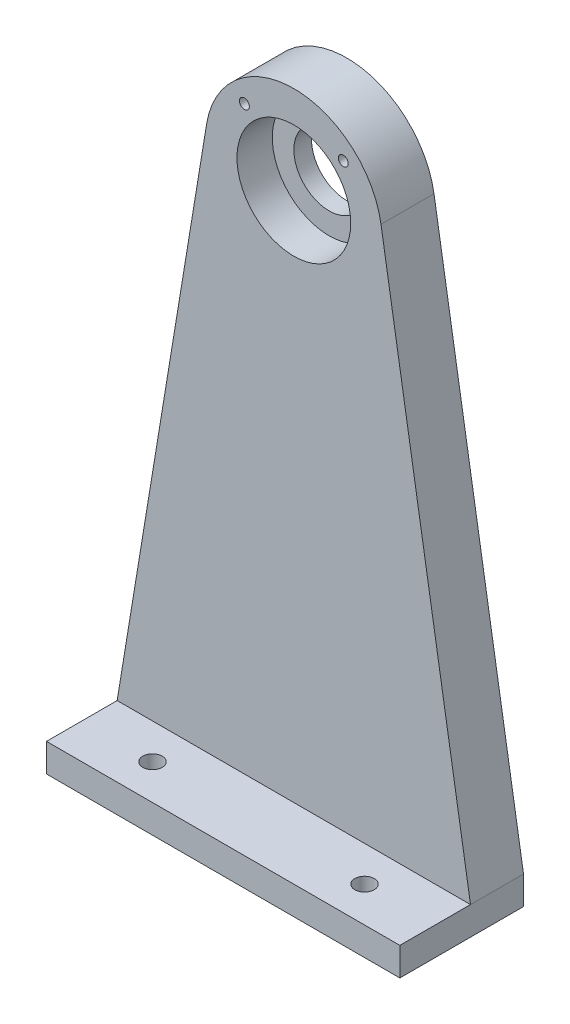
ISO-10303-21;
HEADER;
FILE_DESCRIPTION(('STEP AP214'),'2;1');
FILE_NAME('part.step','',(''),(''),'','','');
FILE_SCHEMA(('AUTOMOTIVE_DESIGN { 1 0 10303 214 1 1 1 1 }'));
ENDSEC;
DATA;
#1=APPLICATION_CONTEXT('core data for automotive mechanical design processes');
#2=APPLICATION_PROTOCOL_DEFINITION('international standard','automotive_design',2000,#1);
#3=PRODUCT_CONTEXT('',#1,'mechanical');
#4=PRODUCT('Part','Part','',(#3));
#5=PRODUCT_RELATED_PRODUCT_CATEGORY('part','',(#4));
#6=PRODUCT_DEFINITION_FORMATION('','',#4);
#7=PRODUCT_DEFINITION_CONTEXT('part definition',#1,'design');
#8=PRODUCT_DEFINITION('design','',#6,#7);
#9=PRODUCT_DEFINITION_SHAPE('','',#8);
#10=(LENGTH_UNIT() NAMED_UNIT(*) SI_UNIT(.MILLI.,.METRE.));
#11=(NAMED_UNIT(*) PLANE_ANGLE_UNIT() SI_UNIT($,.RADIAN.));
#12=(NAMED_UNIT(*) SI_UNIT($,.STERADIAN.) SOLID_ANGLE_UNIT());
#13=UNCERTAINTY_MEASURE_WITH_UNIT(LENGTH_MEASURE(1.E-05),#10,'distance_accuracy_value','');
#14=(GEOMETRIC_REPRESENTATION_CONTEXT(3) GLOBAL_UNCERTAINTY_ASSIGNED_CONTEXT((#13)) GLOBAL_UNIT_ASSIGNED_CONTEXT((#10,
#11,#12)) REPRESENTATION_CONTEXT('',''));
#15=CARTESIAN_POINT('',(0.,0.,0.));
#16=DIRECTION('',(0.,0.,1.));
#17=DIRECTION('',(1.,0.,0.));
#18=AXIS2_PLACEMENT_3D('',#15,#16,#17);
#19=CARTESIAN_POINT('',(0.,0.,7.5));
#20=DIRECTION('',(0.,0.,-1.));
#21=DIRECTION('',(-1.,0.,0.));
#22=AXIS2_PLACEMENT_3D('',#19,#20,#21);
#23=CYLINDRICAL_SURFACE('',#22,25.);
#24=CARTESIAN_POINT('',(0.,0.,-7.5));
#25=DIRECTION('',(0.,0.,1.));
#26=DIRECTION('',(1.,0.,0.));
#27=AXIS2_PLACEMENT_3D('',#24,#25,#26);
#28=CIRCLE('',#27,25.);
#29=CARTESIAN_POINT('',(24.668742493994,4.056247497998,-7.5));
#30=VERTEX_POINT('',#29);
#31=CARTESIAN_POINT('',(-24.668742493994,4.05624749799799,-7.5));
#32=VERTEX_POINT('',#31);
#33=EDGE_CURVE('E105',#30,#32,#28,.T.);
#34=ORIENTED_EDGE('',*,*,#33,.T.);
#35=DIRECTION('',(0.,0.,-1.));
#36=VECTOR('',#35,1.);
#37=CARTESIAN_POINT('',(-24.668742493994,4.05624749799799,7.5));
#38=LINE('',#37,#36);
#39=CARTESIAN_POINT('',(-24.668742493994,4.05624749799799,7.5));
#40=VERTEX_POINT('',#39);
#41=EDGE_CURVE('E11',#40,#32,#38,.T.);
#42=ORIENTED_EDGE('',*,*,#41,.F.);
#43=CARTESIAN_POINT('',(0.,0.,7.5));
#44=DIRECTION('',(0.,0.,1.));
#45=DIRECTION('',(1.,0.,0.));
#46=AXIS2_PLACEMENT_3D('',#43,#44,#45);
#47=CIRCLE('',#46,25.);
#48=CARTESIAN_POINT('',(24.668742493994,4.056247497998,7.5));
#49=VERTEX_POINT('',#48);
#50=EDGE_CURVE('E97',#49,#40,#47,.T.);
#51=ORIENTED_EDGE('',*,*,#50,.F.);
#52=DIRECTION('',(0.,0.,-1.));
#53=VECTOR('',#52,1.);
#54=CARTESIAN_POINT('',(24.668742493994,4.056247497998,7.5));
#55=LINE('',#54,#53);
#56=EDGE_CURVE('E106',#49,#30,#55,.T.);
#57=ORIENTED_EDGE('',*,*,#56,.T.);
#58=EDGE_LOOP('',(#34,#42,#51,#57));
#59=FACE_BOUND('',#58,.T.);
#60=ADVANCED_FACE('F41',(#59),#23,.T.);
#61=CARTESIAN_POINT('',(-50.,-150.,7.5));
#62=DIRECTION('',(0.98674969975976,-0.16224989991992,0.));
#63=DIRECTION('',(0.16224989991992,0.98674969975976,0.));
#64=AXIS2_PLACEMENT_3D('',#61,#62,#63);
#65=PLANE('',#64);
#66=DIRECTION('',(-0.16224989991992,-0.98674969975976,0.));
#67=VECTOR('',#66,1.);
#68=CARTESIAN_POINT('',(-50.,-150.,-7.5));
#69=LINE('',#68,#67);
#70=CARTESIAN_POINT('',(-50.,-150.,-7.5));
#71=VERTEX_POINT('',#70);
#72=EDGE_CURVE('E72',#32,#71,#69,.T.);
#73=ORIENTED_EDGE('',*,*,#72,.T.);
#74=DIRECTION('',(0.,0.,-1.));
#75=VECTOR('',#74,1.);
#76=CARTESIAN_POINT('',(-50.,-150.,7.5));
#77=LINE('',#76,#75);
#78=CARTESIAN_POINT('',(-50.,-150.,7.5));
#79=VERTEX_POINT('',#78);
#80=EDGE_CURVE('E50',#79,#71,#77,.T.);
#81=ORIENTED_EDGE('',*,*,#80,.F.);
#82=DIRECTION('',(-0.16224989991992,-0.98674969975976,0.));
#83=VECTOR('',#82,1.);
#84=CARTESIAN_POINT('',(-50.,-150.,7.5));
#85=LINE('',#84,#83);
#86=EDGE_CURVE('E92',#40,#79,#85,.T.);
#87=ORIENTED_EDGE('',*,*,#86,.F.);
#88=ORIENTED_EDGE('',*,*,#41,.T.);
#89=EDGE_LOOP('',(#73,#81,#87,#88));
#90=FACE_BOUND('',#89,.T.);
#91=ADVANCED_FACE('F93',(#90),#65,.F.);
#92=CARTESIAN_POINT('',(24.668742493994,4.056247497998,7.5));
#93=DIRECTION('',(-0.98674969975976,-0.16224989991992,0.));
#94=DIRECTION('',(0.16224989991992,-0.98674969975976,0.));
#95=AXIS2_PLACEMENT_3D('',#92,#93,#94);
#96=PLANE('',#95);
#97=DIRECTION('',(-0.16224989991992,0.98674969975976,0.));
#98=VECTOR('',#97,1.);
#99=CARTESIAN_POINT('',(24.668742493994,4.056247497998,-7.5));
#100=LINE('',#99,#98);
#101=CARTESIAN_POINT('',(50.,-150.,-7.5));
#102=VERTEX_POINT('',#101);
#103=EDGE_CURVE('E103',#102,#30,#100,.T.);
#104=ORIENTED_EDGE('',*,*,#103,.T.);
#105=ORIENTED_EDGE('',*,*,#56,.F.);
#106=DIRECTION('',(-0.16224989991992,0.98674969975976,0.));
#107=VECTOR('',#106,1.);
#108=CARTESIAN_POINT('',(24.668742493994,4.056247497998,7.5));
#109=LINE('',#108,#107);
#110=CARTESIAN_POINT('',(50.,-150.,7.5));
#111=VERTEX_POINT('',#110);
#112=EDGE_CURVE('E59',#111,#49,#109,.T.);
#113=ORIENTED_EDGE('',*,*,#112,.F.);
#114=DIRECTION('',(0.,0.,-1.));
#115=VECTOR('',#114,1.);
#116=CARTESIAN_POINT('',(50.,-150.,7.5));
#117=LINE('',#116,#115);
#118=EDGE_CURVE('E118',#111,#102,#117,.T.);
#119=ORIENTED_EDGE('',*,*,#118,.T.);
#120=EDGE_LOOP('',(#104,#105,#113,#119));
#121=FACE_BOUND('',#120,.T.);
#122=ADVANCED_FACE('F174',(#121),#96,.F.);
#123=CARTESIAN_POINT('',(0.,0.,7.5));
#124=DIRECTION('',(0.,0.,1.));
#125=DIRECTION('',(1.,0.,0.));
#126=AXIS2_PLACEMENT_3D('',#123,#124,#125);
#127=PLANE('',#126);
#128=CARTESIAN_POINT('',(14.,14.2828568570857,7.5));
#129=DIRECTION('',(0.,0.,1.));
#130=DIRECTION('',(1.,0.,0.));
#131=AXIS2_PLACEMENT_3D('',#128,#129,#130);
#132=CIRCLE('',#131,1.4);
#133=CARTESIAN_POINT('',(15.4,14.2828568570857,7.5));
#134=VERTEX_POINT('',#133);
#135=EDGE_CURVE('E310',#134,#134,#132,.T.);
#136=ORIENTED_EDGE('',*,*,#135,.F.);
#137=EDGE_LOOP('',(#136));
#138=FACE_BOUND('',#137,.T.);
#139=CARTESIAN_POINT('',(-14.,14.2828568570857,7.5));
#140=DIRECTION('',(0.,0.,1.));
#141=DIRECTION('',(1.,0.,0.));
#142=AXIS2_PLACEMENT_3D('',#139,#140,#141);
#143=CIRCLE('',#142,1.4);
#144=CARTESIAN_POINT('',(-12.6,14.2828568570857,7.5));
#145=VERTEX_POINT('',#144);
#146=EDGE_CURVE('E297',#145,#145,#143,.T.);
#147=ORIENTED_EDGE('',*,*,#146,.F.);
#148=EDGE_LOOP('',(#147));
#149=FACE_BOUND('',#148,.T.);
#150=CARTESIAN_POINT('',(0.,0.,7.5));
#151=DIRECTION('',(0.,0.,1.));
#152=DIRECTION('',(1.,0.,0.));
#153=AXIS2_PLACEMENT_3D('',#150,#151,#152);
#154=CIRCLE('',#153,16.1);
#155=CARTESIAN_POINT('',(16.1,0.,7.5));
#156=VERTEX_POINT('',#155);
#157=EDGE_CURVE('E124',#156,#156,#154,.T.);
#158=ORIENTED_EDGE('',*,*,#157,.F.);
#159=EDGE_LOOP('',(#158));
#160=FACE_BOUND('',#159,.T.);
#161=ORIENTED_EDGE('',*,*,#50,.T.);
#162=ORIENTED_EDGE('',*,*,#86,.T.);
#163=DIRECTION('',(1.,0.,0.));
#164=VECTOR('',#163,1.);
#165=CARTESIAN_POINT('',(50.,-150.,7.5));
#166=LINE('',#165,#164);
#167=EDGE_CURVE('E80',#79,#111,#166,.T.);
#168=ORIENTED_EDGE('',*,*,#167,.T.);
#169=ORIENTED_EDGE('',*,*,#112,.T.);
#170=EDGE_LOOP('',(#161,#162,#168,#169));
#171=FACE_BOUND('',#170,.T.);
#172=ADVANCED_FACE('F100',(#138,#149,#160,#171),#127,.T.);
#173=CARTESIAN_POINT('',(0.,0.,-7.5));
#174=DIRECTION('',(0.,0.,1.));
#175=DIRECTION('',(1.,0.,0.));
#176=AXIS2_PLACEMENT_3D('',#173,#174,#175);
#177=PLANE('',#176);
#178=CARTESIAN_POINT('',(-9.,-50.,-7.5));
#179=DIRECTION('',(0.,0.,-1.));
#180=DIRECTION('',(-1.,0.,0.));
#181=AXIS2_PLACEMENT_3D('',#178,#179,#180);
#182=CIRCLE('',#181,1.4);
#183=CARTESIAN_POINT('',(-10.4,-50.,-7.5));
#184=VERTEX_POINT('',#183);
#185=EDGE_CURVE('E294',#184,#184,#182,.T.);
#186=ORIENTED_EDGE('',*,*,#185,.F.);
#187=EDGE_LOOP('',(#186));
#188=FACE_BOUND('',#187,.T.);
#189=CARTESIAN_POINT('',(9.,-50.,-7.5));
#190=DIRECTION('',(0.,0.,-1.));
#191=DIRECTION('',(-1.,0.,0.));
#192=AXIS2_PLACEMENT_3D('',#189,#190,#191);
#193=CIRCLE('',#192,1.4);
#194=CARTESIAN_POINT('',(7.6,-50.,-7.5));
#195=VERTEX_POINT('',#194);
#196=EDGE_CURVE('E299',#195,#195,#193,.T.);
#197=ORIENTED_EDGE('',*,*,#196,.F.);
#198=EDGE_LOOP('',(#197));
#199=FACE_BOUND('',#198,.T.);
#200=CARTESIAN_POINT('',(0.,0.,-7.5));
#201=DIRECTION('',(0.,0.,1.));
#202=DIRECTION('',(1.,0.,0.));
#203=AXIS2_PLACEMENT_3D('',#200,#201,#202);
#204=CIRCLE('',#203,10.);
#205=CARTESIAN_POINT('',(10.,0.,-7.5));
#206=VERTEX_POINT('',#205);
#207=EDGE_CURVE('E122',#206,#206,#204,.T.);
#208=ORIENTED_EDGE('',*,*,#207,.T.);
#209=EDGE_LOOP('',(#208));
#210=FACE_BOUND('',#209,.T.);
#211=ORIENTED_EDGE('',*,*,#33,.F.);
#212=ORIENTED_EDGE('',*,*,#103,.F.);
#213=DIRECTION('',(0.,1.,0.));
#214=VECTOR('',#213,1.);
#215=CARTESIAN_POINT('',(50.,-158.,-7.5));
#216=LINE('',#215,#214);
#217=CARTESIAN_POINT('',(50.,-158.,-7.5));
#218=VERTEX_POINT('',#217);
#219=EDGE_CURVE('E111',#218,#102,#216,.T.);
#220=ORIENTED_EDGE('',*,*,#219,.F.);
#221=DIRECTION('',(1.,0.,0.));
#222=VECTOR('',#221,1.);
#223=CARTESIAN_POINT('',(-50.,-158.,-7.5));
#224=LINE('',#223,#222);
#225=CARTESIAN_POINT('',(-50.,-158.,-7.5));
#226=VERTEX_POINT('',#225);
#227=EDGE_CURVE('E151',#226,#218,#224,.T.);
#228=ORIENTED_EDGE('',*,*,#227,.F.);
#229=DIRECTION('',(0.,1.,0.));
#230=VECTOR('',#229,1.);
#231=CARTESIAN_POINT('',(-50.,-158.,-7.5));
#232=LINE('',#231,#230);
#233=EDGE_CURVE('E108',#226,#71,#232,.T.);
#234=ORIENTED_EDGE('',*,*,#233,.T.);
#235=ORIENTED_EDGE('',*,*,#72,.F.);
#236=EDGE_LOOP('',(#211,#212,#220,#228,#234,#235));
#237=FACE_BOUND('',#236,.T.);
#238=ADVANCED_FACE('F177',(#188,#199,#210,#237),#177,.F.);
#239=CARTESIAN_POINT('',(0.,-150.,0.));
#240=DIRECTION('',(0.,1.,0.));
#241=DIRECTION('',(0.,0.,1.));
#242=AXIS2_PLACEMENT_3D('',#239,#240,#241);
#243=PLANE('',#242);
#244=CARTESIAN_POINT('',(30.,-150.,17.5));
#245=DIRECTION('',(0.,1.,0.));
#246=DIRECTION('',(0.,0.,1.));
#247=AXIS2_PLACEMENT_3D('',#244,#245,#246);
#248=CIRCLE('',#247,2.75);
#249=CARTESIAN_POINT('',(30.,-150.,20.25));
#250=VERTEX_POINT('',#249);
#251=EDGE_CURVE('E138',#250,#250,#248,.T.);
#252=ORIENTED_EDGE('',*,*,#251,.F.);
#253=EDGE_LOOP('',(#252));
#254=FACE_BOUND('',#253,.T.);
#255=CARTESIAN_POINT('',(-30.,-150.,17.5));
#256=DIRECTION('',(0.,1.,0.));
#257=DIRECTION('',(0.,0.,1.));
#258=AXIS2_PLACEMENT_3D('',#255,#256,#257);
#259=CIRCLE('',#258,2.75);
#260=CARTESIAN_POINT('',(-30.,-150.,20.25));
#261=VERTEX_POINT('',#260);
#262=EDGE_CURVE('E128',#261,#261,#259,.T.);
#263=ORIENTED_EDGE('',*,*,#262,.F.);
#264=EDGE_LOOP('',(#263));
#265=FACE_BOUND('',#264,.T.);
#266=ORIENTED_EDGE('',*,*,#167,.F.);
#267=DIRECTION('',(0.,0.,-1.));
#268=VECTOR('',#267,1.);
#269=CARTESIAN_POINT('',(-50.,-150.,-7.5));
#270=LINE('',#269,#268);
#271=CARTESIAN_POINT('',(-50.,-150.,27.5));
#272=VERTEX_POINT('',#271);
#273=EDGE_CURVE('E145',#272,#79,#270,.T.);
#274=ORIENTED_EDGE('',*,*,#273,.F.);
#275=DIRECTION('',(-1.,0.,0.));
#276=VECTOR('',#275,1.);
#277=CARTESIAN_POINT('',(-50.,-150.,27.5));
#278=LINE('',#277,#276);
#279=CARTESIAN_POINT('',(50.,-150.,27.5));
#280=VERTEX_POINT('',#279);
#281=EDGE_CURVE('E152',#280,#272,#278,.T.);
#282=ORIENTED_EDGE('',*,*,#281,.F.);
#283=DIRECTION('',(0.,0.,1.));
#284=VECTOR('',#283,1.);
#285=CARTESIAN_POINT('',(50.,-150.,-7.5));
#286=LINE('',#285,#284);
#287=EDGE_CURVE('E162',#111,#280,#286,.T.);
#288=ORIENTED_EDGE('',*,*,#287,.F.);
#289=EDGE_LOOP('',(#266,#274,#282,#288));
#290=FACE_BOUND('',#289,.T.);
#291=ADVANCED_FACE('F200',(#254,#265,#290),#243,.T.);
#292=CARTESIAN_POINT('',(-50.,-158.,-7.5));
#293=DIRECTION('',(1.,0.,0.));
#294=DIRECTION('',(0.,0.,-1.));
#295=AXIS2_PLACEMENT_3D('',#292,#293,#294);
#296=PLANE('',#295);
#297=ORIENTED_EDGE('',*,*,#273,.T.);
#298=ORIENTED_EDGE('',*,*,#80,.T.);
#299=ORIENTED_EDGE('',*,*,#233,.F.);
#300=DIRECTION('',(0.,0.,-1.));
#301=VECTOR('',#300,1.);
#302=CARTESIAN_POINT('',(-50.,-158.,-7.5));
#303=LINE('',#302,#301);
#304=CARTESIAN_POINT('',(-50.,-158.,27.5));
#305=VERTEX_POINT('',#304);
#306=EDGE_CURVE('E148',#305,#226,#303,.T.);
#307=ORIENTED_EDGE('',*,*,#306,.F.);
#308=DIRECTION('',(0.,1.,0.));
#309=VECTOR('',#308,1.);
#310=CARTESIAN_POINT('',(-50.,-158.,27.5));
#311=LINE('',#310,#309);
#312=EDGE_CURVE('E160',#305,#272,#311,.T.);
#313=ORIENTED_EDGE('',*,*,#312,.T.);
#314=EDGE_LOOP('',(#297,#298,#299,#307,#313));
#315=FACE_BOUND('',#314,.T.);
#316=ADVANCED_FACE('F198',(#315),#296,.F.);
#317=CARTESIAN_POINT('',(50.,-158.,-7.5));
#318=DIRECTION('',(-1.,0.,0.));
#319=DIRECTION('',(0.,0.,1.));
#320=AXIS2_PLACEMENT_3D('',#317,#318,#319);
#321=PLANE('',#320);
#322=ORIENTED_EDGE('',*,*,#118,.F.);
#323=ORIENTED_EDGE('',*,*,#287,.T.);
#324=DIRECTION('',(0.,1.,0.));
#325=VECTOR('',#324,1.);
#326=CARTESIAN_POINT('',(50.,-158.,27.5));
#327=LINE('',#326,#325);
#328=CARTESIAN_POINT('',(50.,-158.,27.5));
#329=VERTEX_POINT('',#328);
#330=EDGE_CURVE('E169',#329,#280,#327,.T.);
#331=ORIENTED_EDGE('',*,*,#330,.F.);
#332=DIRECTION('',(0.,0.,1.));
#333=VECTOR('',#332,1.);
#334=CARTESIAN_POINT('',(50.,-158.,-7.5));
#335=LINE('',#334,#333);
#336=EDGE_CURVE('E155',#218,#329,#335,.T.);
#337=ORIENTED_EDGE('',*,*,#336,.F.);
#338=ORIENTED_EDGE('',*,*,#219,.T.);
#339=EDGE_LOOP('',(#322,#323,#331,#337,#338));
#340=FACE_BOUND('',#339,.T.);
#341=ADVANCED_FACE('F208',(#340),#321,.F.);
#342=CARTESIAN_POINT('',(-50.,-158.,27.5));
#343=DIRECTION('',(0.,0.,-1.));
#344=DIRECTION('',(-1.,0.,0.));
#345=AXIS2_PLACEMENT_3D('',#342,#343,#344);
#346=PLANE('',#345);
#347=ORIENTED_EDGE('',*,*,#281,.T.);
#348=ORIENTED_EDGE('',*,*,#312,.F.);
#349=DIRECTION('',(-1.,0.,0.));
#350=VECTOR('',#349,1.);
#351=CARTESIAN_POINT('',(-50.,-158.,27.5));
#352=LINE('',#351,#350);
#353=EDGE_CURVE('E158',#329,#305,#352,.T.);
#354=ORIENTED_EDGE('',*,*,#353,.F.);
#355=ORIENTED_EDGE('',*,*,#330,.T.);
#356=EDGE_LOOP('',(#347,#348,#354,#355));
#357=FACE_BOUND('',#356,.T.);
#358=ADVANCED_FACE('F193',(#357),#346,.F.);
#359=CARTESIAN_POINT('',(0.,-158.,0.));
#360=DIRECTION('',(0.,1.,0.));
#361=DIRECTION('',(0.,0.,1.));
#362=AXIS2_PLACEMENT_3D('',#359,#360,#361);
#363=PLANE('',#362);
#364=CARTESIAN_POINT('',(30.,-158.,17.5));
#365=DIRECTION('',(0.,1.,0.));
#366=DIRECTION('',(0.,0.,1.));
#367=AXIS2_PLACEMENT_3D('',#364,#365,#366);
#368=CIRCLE('',#367,2.75);
#369=CARTESIAN_POINT('',(30.,-158.,20.25));
#370=VERTEX_POINT('',#369);
#371=EDGE_CURVE('E44',#370,#370,#368,.T.);
#372=ORIENTED_EDGE('',*,*,#371,.T.);
#373=EDGE_LOOP('',(#372));
#374=FACE_BOUND('',#373,.T.);
#375=CARTESIAN_POINT('',(-30.,-158.,17.5));
#376=DIRECTION('',(0.,1.,0.));
#377=DIRECTION('',(0.,0.,1.));
#378=AXIS2_PLACEMENT_3D('',#375,#376,#377);
#379=CIRCLE('',#378,2.75);
#380=CARTESIAN_POINT('',(-30.,-158.,20.25));
#381=VERTEX_POINT('',#380);
#382=EDGE_CURVE('E126',#381,#381,#379,.T.);
#383=ORIENTED_EDGE('',*,*,#382,.T.);
#384=EDGE_LOOP('',(#383));
#385=FACE_BOUND('',#384,.T.);
#386=ORIENTED_EDGE('',*,*,#306,.T.);
#387=ORIENTED_EDGE('',*,*,#227,.T.);
#388=ORIENTED_EDGE('',*,*,#336,.T.);
#389=ORIENTED_EDGE('',*,*,#353,.T.);
#390=EDGE_LOOP('',(#386,#387,#388,#389));
#391=FACE_BOUND('',#390,.T.);
#392=ADVANCED_FACE('F230',(#374,#385,#391),#363,.F.);
#393=CARTESIAN_POINT('',(0.,0.,-2.5));
#394=DIRECTION('',(0.,0.,1.));
#395=DIRECTION('',(1.,0.,0.));
#396=AXIS2_PLACEMENT_3D('',#393,#394,#395);
#397=CYLINDRICAL_SURFACE('',#396,16.1);
#398=CARTESIAN_POINT('',(0.,0.,-2.5));
#399=DIRECTION('',(0.,0.,1.));
#400=DIRECTION('',(1.,0.,0.));
#401=AXIS2_PLACEMENT_3D('',#398,#399,#400);
#402=CIRCLE('',#401,16.1);
#403=CARTESIAN_POINT('',(16.1,0.,-2.5));
#404=VERTEX_POINT('',#403);
#405=EDGE_CURVE('E142',#404,#404,#402,.T.);
#406=ORIENTED_EDGE('',*,*,#405,.F.);
#407=EDGE_LOOP('',(#406));
#408=FACE_BOUND('',#407,.T.);
#409=ORIENTED_EDGE('',*,*,#157,.T.);
#410=EDGE_LOOP('',(#409));
#411=FACE_BOUND('',#410,.T.);
#412=ADVANCED_FACE('F234',(#408,#411),#397,.F.);
#413=CARTESIAN_POINT('',(0.,0.,-2.5));
#414=DIRECTION('',(0.,0.,1.));
#415=DIRECTION('',(1.,0.,0.));
#416=AXIS2_PLACEMENT_3D('',#413,#414,#415);
#417=PLANE('',#416);
#418=CARTESIAN_POINT('',(0.,0.,-2.5));
#419=DIRECTION('',(0.,0.,1.));
#420=DIRECTION('',(1.,0.,0.));
#421=AXIS2_PLACEMENT_3D('',#418,#419,#420);
#422=CIRCLE('',#421,10.);
#423=CARTESIAN_POINT('',(10.,0.,-2.5));
#424=VERTEX_POINT('',#423);
#425=EDGE_CURVE('E125',#424,#424,#422,.T.);
#426=ORIENTED_EDGE('',*,*,#425,.F.);
#427=EDGE_LOOP('',(#426));
#428=FACE_BOUND('',#427,.T.);
#429=ORIENTED_EDGE('',*,*,#405,.T.);
#430=EDGE_LOOP('',(#429));
#431=FACE_BOUND('',#430,.T.);
#432=ADVANCED_FACE('F239',(#428,#431),#417,.T.);
#433=CARTESIAN_POINT('',(0.,0.,-22.5));
#434=DIRECTION('',(0.,0.,1.));
#435=DIRECTION('',(1.,0.,0.));
#436=AXIS2_PLACEMENT_3D('',#433,#434,#435);
#437=CYLINDRICAL_SURFACE('',#436,10.);
#438=ORIENTED_EDGE('',*,*,#425,.T.);
#439=EDGE_LOOP('',(#438));
#440=FACE_BOUND('',#439,.T.);
#441=ORIENTED_EDGE('',*,*,#207,.F.);
#442=EDGE_LOOP('',(#441));
#443=FACE_BOUND('',#442,.T.);
#444=ADVANCED_FACE('F245',(#440,#443),#437,.F.);
#445=CARTESIAN_POINT('',(-30.,-150.,17.5));
#446=DIRECTION('',(0.,1.,0.));
#447=DIRECTION('',(0.,0.,1.));
#448=AXIS2_PLACEMENT_3D('',#445,#446,#447);
#449=CYLINDRICAL_SURFACE('',#448,2.75);
#450=ORIENTED_EDGE('',*,*,#262,.T.);
#451=EDGE_LOOP('',(#450));
#452=FACE_BOUND('',#451,.T.);
#453=ORIENTED_EDGE('',*,*,#382,.F.);
#454=EDGE_LOOP('',(#453));
#455=FACE_BOUND('',#454,.T.);
#456=ADVANCED_FACE('F249',(#452,#455),#449,.F.);
#457=CARTESIAN_POINT('',(30.,-150.,17.5));
#458=DIRECTION('',(0.,1.,0.));
#459=DIRECTION('',(0.,0.,1.));
#460=AXIS2_PLACEMENT_3D('',#457,#458,#459);
#461=CYLINDRICAL_SURFACE('',#460,2.75);
#462=ORIENTED_EDGE('',*,*,#251,.T.);
#463=EDGE_LOOP('',(#462));
#464=FACE_BOUND('',#463,.T.);
#465=ORIENTED_EDGE('',*,*,#371,.F.);
#466=EDGE_LOOP('',(#465));
#467=FACE_BOUND('',#466,.T.);
#468=ADVANCED_FACE('F253',(#464,#467),#461,.F.);
#469=CARTESIAN_POINT('',(-14.,14.2828568570857,-0.5));
#470=DIRECTION('',(0.,0.,1.));
#471=DIRECTION('',(1.,0.,0.));
#472=AXIS2_PLACEMENT_3D('',#469,#470,#471);
#473=CYLINDRICAL_SURFACE('',#472,1.4);
#474=CARTESIAN_POINT('',(-14.,14.2828568570857,-0.5));
#475=DIRECTION('',(0.,0.,1.));
#476=DIRECTION('',(1.,0.,0.));
#477=AXIS2_PLACEMENT_3D('',#474,#475,#476);
#478=CIRCLE('',#477,1.4);
#479=CARTESIAN_POINT('',(-12.6,14.2828568570857,-0.5));
#480=VERTEX_POINT('',#479);
#481=EDGE_CURVE('E293',#480,#480,#478,.T.);
#482=ORIENTED_EDGE('',*,*,#481,.F.);
#483=EDGE_LOOP('',(#482));
#484=FACE_BOUND('',#483,.T.);
#485=ORIENTED_EDGE('',*,*,#146,.T.);
#486=EDGE_LOOP('',(#485));
#487=FACE_BOUND('',#486,.T.);
#488=ADVANCED_FACE('F256',(#484,#487),#473,.F.);
#489=CARTESIAN_POINT('',(-14.,14.2828568570857,-0.5));
#490=DIRECTION('',(0.,0.,1.));
#491=DIRECTION('',(1.,0.,0.));
#492=AXIS2_PLACEMENT_3D('',#489,#490,#491);
#493=PLANE('',#492);
#494=ORIENTED_EDGE('',*,*,#481,.T.);
#495=EDGE_LOOP('',(#494));
#496=FACE_BOUND('',#495,.T.);
#497=ADVANCED_FACE('F258',(#496),#493,.T.);
#498=CARTESIAN_POINT('',(14.,14.2828568570857,-0.5));
#499=DIRECTION('',(0.,0.,1.));
#500=DIRECTION('',(1.,0.,0.));
#501=AXIS2_PLACEMENT_3D('',#498,#499,#500);
#502=CYLINDRICAL_SURFACE('',#501,1.4);
#503=CARTESIAN_POINT('',(14.,14.2828568570857,-0.5));
#504=DIRECTION('',(0.,0.,1.));
#505=DIRECTION('',(1.,0.,0.));
#506=AXIS2_PLACEMENT_3D('',#503,#504,#505);
#507=CIRCLE('',#506,1.4);
#508=CARTESIAN_POINT('',(15.4,14.2828568570857,-0.5));
#509=VERTEX_POINT('',#508);
#510=EDGE_CURVE('E307',#509,#509,#507,.T.);
#511=ORIENTED_EDGE('',*,*,#510,.F.);
#512=EDGE_LOOP('',(#511));
#513=FACE_BOUND('',#512,.T.);
#514=ORIENTED_EDGE('',*,*,#135,.T.);
#515=EDGE_LOOP('',(#514));
#516=FACE_BOUND('',#515,.T.);
#517=ADVANCED_FACE('F261',(#513,#516),#502,.F.);
#518=CARTESIAN_POINT('',(14.,14.2828568570857,-0.5));
#519=DIRECTION('',(0.,0.,1.));
#520=DIRECTION('',(1.,0.,0.));
#521=AXIS2_PLACEMENT_3D('',#518,#519,#520);
#522=PLANE('',#521);
#523=ORIENTED_EDGE('',*,*,#510,.T.);
#524=EDGE_LOOP('',(#523));
#525=FACE_BOUND('',#524,.T.);
#526=ADVANCED_FACE('F268',(#525),#522,.T.);
#527=CARTESIAN_POINT('',(9.,-50.,0.5));
#528=DIRECTION('',(0.,0.,-1.));
#529=DIRECTION('',(-1.,0.,0.));
#530=AXIS2_PLACEMENT_3D('',#527,#528,#529);
#531=CYLINDRICAL_SURFACE('',#530,1.4);
#532=CARTESIAN_POINT('',(9.,-50.,0.5));
#533=DIRECTION('',(0.,0.,-1.));
#534=DIRECTION('',(-1.,0.,0.));
#535=AXIS2_PLACEMENT_3D('',#532,#533,#534);
#536=CIRCLE('',#535,1.4);
#537=CARTESIAN_POINT('',(7.6,-50.,0.5));
#538=VERTEX_POINT('',#537);
#539=EDGE_CURVE('E304',#538,#538,#536,.T.);
#540=ORIENTED_EDGE('',*,*,#539,.F.);
#541=EDGE_LOOP('',(#540));
#542=FACE_BOUND('',#541,.T.);
#543=ORIENTED_EDGE('',*,*,#196,.T.);
#544=EDGE_LOOP('',(#543));
#545=FACE_BOUND('',#544,.T.);
#546=ADVANCED_FACE('F272',(#542,#545),#531,.F.);
#547=CARTESIAN_POINT('',(9.,-50.,0.5));
#548=DIRECTION('',(0.,0.,-1.));
#549=DIRECTION('',(-1.,0.,0.));
#550=AXIS2_PLACEMENT_3D('',#547,#548,#549);
#551=PLANE('',#550);
#552=ORIENTED_EDGE('',*,*,#539,.T.);
#553=EDGE_LOOP('',(#552));
#554=FACE_BOUND('',#553,.T.);
#555=ADVANCED_FACE('F274',(#554),#551,.T.);
#556=CARTESIAN_POINT('',(-9.,-50.,0.5));
#557=DIRECTION('',(0.,0.,-1.));
#558=DIRECTION('',(-1.,0.,0.));
#559=AXIS2_PLACEMENT_3D('',#556,#557,#558);
#560=CYLINDRICAL_SURFACE('',#559,1.4);
#561=CARTESIAN_POINT('',(-9.,-50.,0.5));
#562=DIRECTION('',(0.,0.,-1.));
#563=DIRECTION('',(-1.,0.,0.));
#564=AXIS2_PLACEMENT_3D('',#561,#562,#563);
#565=CIRCLE('',#564,1.4);
#566=CARTESIAN_POINT('',(-10.4,-50.,0.5));
#567=VERTEX_POINT('',#566);
#568=EDGE_CURVE('E292',#567,#567,#565,.T.);
#569=ORIENTED_EDGE('',*,*,#568,.F.);
#570=EDGE_LOOP('',(#569));
#571=FACE_BOUND('',#570,.T.);
#572=ORIENTED_EDGE('',*,*,#185,.T.);
#573=EDGE_LOOP('',(#572));
#574=FACE_BOUND('',#573,.T.);
#575=ADVANCED_FACE('F277',(#571,#574),#560,.F.);
#576=CARTESIAN_POINT('',(-9.,-50.,0.5));
#577=DIRECTION('',(0.,0.,-1.));
#578=DIRECTION('',(-1.,0.,0.));
#579=AXIS2_PLACEMENT_3D('',#576,#577,#578);
#580=PLANE('',#579);
#581=ORIENTED_EDGE('',*,*,#568,.T.);
#582=EDGE_LOOP('',(#581));
#583=FACE_BOUND('',#582,.T.);
#584=ADVANCED_FACE('F284',(#583),#580,.T.);
#585=CLOSED_SHELL('',(#60,#91,#122,#172,#238,#291,#316,#341,#358,#392,#412,#432,#444,#456,#468,
#488,#497,#517,#526,#546,#555,#575,#584));
#586=MANIFOLD_SOLID_BREP('B2',#585);
#587=ADVANCED_BREP_SHAPE_REPRESENTATION('',(#18,#586),#14);
#588=SHAPE_DEFINITION_REPRESENTATION(#9,#587);
ENDSEC;
END-ISO-10303-21;
